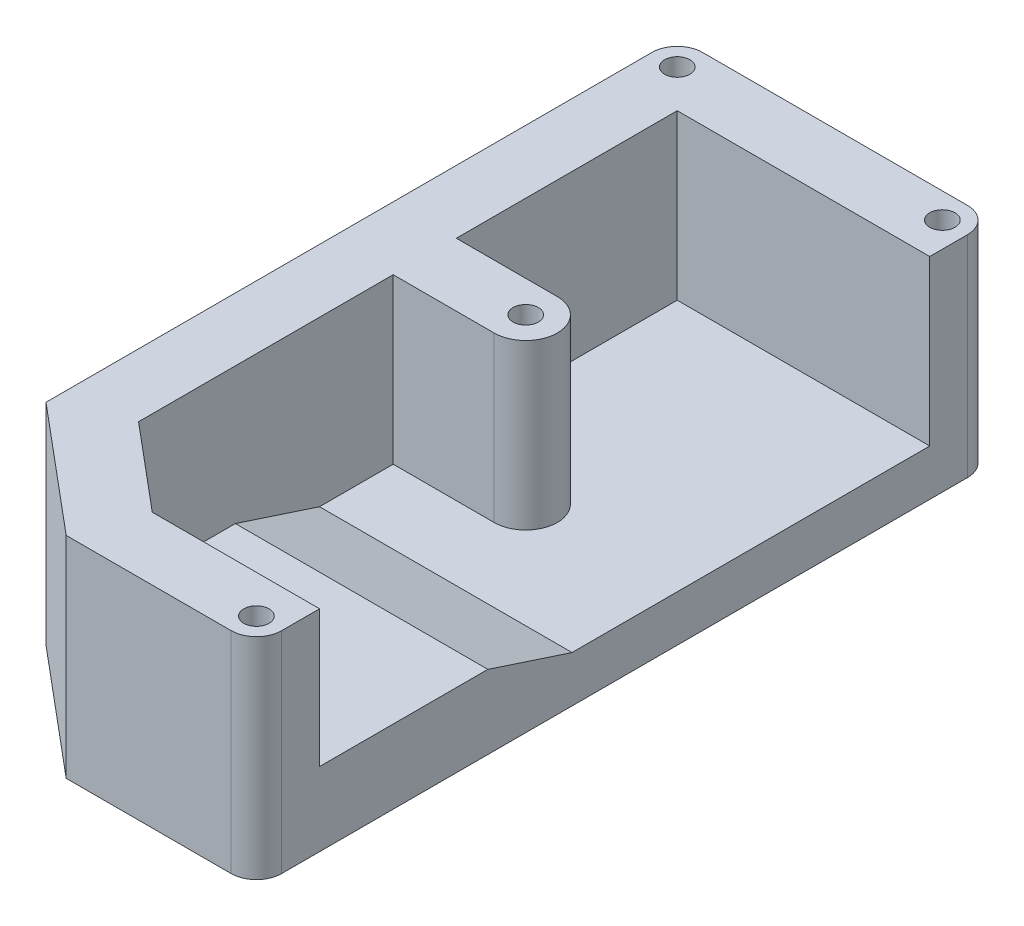
ISO-10303-21;
HEADER;
FILE_DESCRIPTION(('STEP AP214'),'2;1');
FILE_NAME('part.step','',(''),(''),'','','');
FILE_SCHEMA(('AUTOMOTIVE_DESIGN { 1 0 10303 214 1 1 1 1 }'));
ENDSEC;
DATA;
#1=APPLICATION_CONTEXT('core data for automotive mechanical design processes');
#2=APPLICATION_PROTOCOL_DEFINITION('international standard','automotive_design',2000,#1);
#3=PRODUCT_CONTEXT('',#1,'mechanical');
#4=PRODUCT('Part','Part','',(#3));
#5=PRODUCT_RELATED_PRODUCT_CATEGORY('part','',(#4));
#6=PRODUCT_DEFINITION_FORMATION('','',#4);
#7=PRODUCT_DEFINITION_CONTEXT('part definition',#1,'design');
#8=PRODUCT_DEFINITION('design','',#6,#7);
#9=PRODUCT_DEFINITION_SHAPE('','',#8);
#10=(LENGTH_UNIT() NAMED_UNIT(*) SI_UNIT(.MILLI.,.METRE.));
#11=(NAMED_UNIT(*) PLANE_ANGLE_UNIT() SI_UNIT($,.RADIAN.));
#12=(NAMED_UNIT(*) SI_UNIT($,.STERADIAN.) SOLID_ANGLE_UNIT());
#13=UNCERTAINTY_MEASURE_WITH_UNIT(LENGTH_MEASURE(1.E-05),#10,'distance_accuracy_value','');
#14=(GEOMETRIC_REPRESENTATION_CONTEXT(3) GLOBAL_UNCERTAINTY_ASSIGNED_CONTEXT((#13)) GLOBAL_UNIT_ASSIGNED_CONTEXT((#10,
#11,#12)) REPRESENTATION_CONTEXT('',''));
#15=CARTESIAN_POINT('',(0.,0.,0.));
#16=DIRECTION('',(0.,0.,1.));
#17=DIRECTION('',(1.,0.,0.));
#18=AXIS2_PLACEMENT_3D('',#15,#16,#17);
#19=CARTESIAN_POINT('',(69.,11.,6.));
#20=DIRECTION('',(0.,-1.,0.));
#21=DIRECTION('',(0.,0.,-1.));
#22=AXIS2_PLACEMENT_3D('',#19,#20,#21);
#23=CYLINDRICAL_SURFACE('',#22,2.);
#24=CARTESIAN_POINT('',(69.,0.,6.));
#25=DIRECTION('',(0.,1.,0.));
#26=DIRECTION('',(0.,0.,1.));
#27=AXIS2_PLACEMENT_3D('',#24,#25,#26);
#28=CIRCLE('',#27,2.);
#29=CARTESIAN_POINT('',(69.,0.,8.));
#30=VERTEX_POINT('',#29);
#31=EDGE_CURVE('E241',#30,#30,#28,.T.);
#32=ORIENTED_EDGE('',*,*,#31,.F.);
#33=EDGE_LOOP('',(#32));
#34=FACE_BOUND('',#33,.T.);
#35=CARTESIAN_POINT('',(69.,44.,6.));
#36=DIRECTION('',(0.,1.,0.));
#37=DIRECTION('',(0.,0.,1.));
#38=AXIS2_PLACEMENT_3D('',#35,#36,#37);
#39=CIRCLE('',#38,2.);
#40=CARTESIAN_POINT('',(69.,44.,8.));
#41=VERTEX_POINT('',#40);
#42=EDGE_CURVE('E435',#41,#41,#39,.F.);
#43=ORIENTED_EDGE('',*,*,#42,.F.);
#44=EDGE_LOOP('',(#43));
#45=FACE_BOUND('',#44,.T.);
#46=ADVANCED_FACE('F41',(#34,#45),#23,.F.);
#47=CARTESIAN_POINT('',(69.,11.,169.));
#48=DIRECTION('',(0.,-1.,0.));
#49=DIRECTION('',(0.,0.,-1.));
#50=AXIS2_PLACEMENT_3D('',#47,#48,#49);
#51=CYLINDRICAL_SURFACE('',#50,2.);
#52=CARTESIAN_POINT('',(69.,0.,169.));
#53=DIRECTION('',(0.,1.,0.));
#54=DIRECTION('',(0.,0.,1.));
#55=AXIS2_PLACEMENT_3D('',#52,#53,#54);
#56=CIRCLE('',#55,2.);
#57=CARTESIAN_POINT('',(69.,0.,171.));
#58=VERTEX_POINT('',#57);
#59=EDGE_CURVE('E237',#58,#58,#56,.T.);
#60=ORIENTED_EDGE('',*,*,#59,.F.);
#61=EDGE_LOOP('',(#60));
#62=FACE_BOUND('',#61,.T.);
#63=CARTESIAN_POINT('',(69.,44.,169.));
#64=DIRECTION('',(0.,1.,0.));
#65=DIRECTION('',(0.,0.,1.));
#66=AXIS2_PLACEMENT_3D('',#63,#64,#65);
#67=CIRCLE('',#66,2.);
#68=CARTESIAN_POINT('',(69.,44.,171.));
#69=VERTEX_POINT('',#68);
#70=EDGE_CURVE('E447',#69,#69,#67,.F.);
#71=ORIENTED_EDGE('',*,*,#70,.F.);
#72=EDGE_LOOP('',(#71));
#73=FACE_BOUND('',#72,.T.);
#74=ADVANCED_FACE('F485',(#62,#73),#51,.F.);
#75=CARTESIAN_POINT('',(6.,11.,6.));
#76=DIRECTION('',(0.,-1.,0.));
#77=DIRECTION('',(0.,0.,-1.));
#78=AXIS2_PLACEMENT_3D('',#75,#76,#77);
#79=CYLINDRICAL_SURFACE('',#78,2.);
#80=CARTESIAN_POINT('',(6.,0.,6.));
#81=DIRECTION('',(0.,1.,0.));
#82=DIRECTION('',(0.,0.,1.));
#83=AXIS2_PLACEMENT_3D('',#80,#81,#82);
#84=CIRCLE('',#83,2.);
#85=CARTESIAN_POINT('',(6.,0.,8.));
#86=VERTEX_POINT('',#85);
#87=EDGE_CURVE('E233',#86,#86,#84,.T.);
#88=ORIENTED_EDGE('',*,*,#87,.F.);
#89=EDGE_LOOP('',(#88));
#90=FACE_BOUND('',#89,.T.);
#91=CARTESIAN_POINT('',(6.,44.,6.));
#92=DIRECTION('',(0.,1.,0.));
#93=DIRECTION('',(0.,0.,1.));
#94=AXIS2_PLACEMENT_3D('',#91,#92,#93);
#95=CIRCLE('',#94,2.);
#96=CARTESIAN_POINT('',(6.,44.,8.));
#97=VERTEX_POINT('',#96);
#98=EDGE_CURVE('E471',#97,#97,#95,.F.);
#99=ORIENTED_EDGE('',*,*,#98,.F.);
#100=EDGE_LOOP('',(#99));
#101=FACE_BOUND('',#100,.T.);
#102=ADVANCED_FACE('F482',(#90,#101),#79,.F.);
#103=CARTESIAN_POINT('',(39.,11.,75.));
#104=DIRECTION('',(0.,-1.,0.));
#105=DIRECTION('',(0.,0.,-1.));
#106=AXIS2_PLACEMENT_3D('',#103,#104,#105);
#107=CYLINDRICAL_SURFACE('',#106,2.);
#108=CARTESIAN_POINT('',(39.,0.,75.));
#109=DIRECTION('',(0.,1.,0.));
#110=DIRECTION('',(0.,0.,1.));
#111=AXIS2_PLACEMENT_3D('',#108,#109,#110);
#112=CIRCLE('',#111,2.);
#113=CARTESIAN_POINT('',(39.,0.,77.));
#114=VERTEX_POINT('',#113);
#115=EDGE_CURVE('E229',#114,#114,#112,.T.);
#116=ORIENTED_EDGE('',*,*,#115,.F.);
#117=EDGE_LOOP('',(#116));
#118=FACE_BOUND('',#117,.T.);
#119=CARTESIAN_POINT('',(39.,44.,75.));
#120=DIRECTION('',(0.,1.,0.));
#121=DIRECTION('',(0.,0.,1.));
#122=AXIS2_PLACEMENT_3D('',#119,#120,#121);
#123=CIRCLE('',#122,2.);
#124=CARTESIAN_POINT('',(39.,44.,77.));
#125=VERTEX_POINT('',#124);
#126=EDGE_CURVE('E459',#125,#125,#123,.F.);
#127=ORIENTED_EDGE('',*,*,#126,.F.);
#128=EDGE_LOOP('',(#127));
#129=FACE_BOUND('',#128,.T.);
#130=ADVANCED_FACE('F484',(#118,#129),#107,.F.);
#131=CARTESIAN_POINT('',(69.,11.,169.));
#132=DIRECTION('',(0.,1.,0.));
#133=DIRECTION('',(0.,0.,1.));
#134=AXIS2_PLACEMENT_3D('',#131,#132,#133);
#135=PLANE('',#134);
#136=DIRECTION('',(0.,0.,1.));
#137=VECTOR('',#136,1.);
#138=CARTESIAN_POINT('',(15.,11.,0.));
#139=LINE('',#138,#137);
#140=CARTESIAN_POINT('',(15.,11.,82.5));
#141=VERTEX_POINT('',#140);
#142=CARTESIAN_POINT('',(15.,11.,100.));
#143=VERTEX_POINT('',#142);
#144=EDGE_CURVE('E374',#141,#143,#139,.T.);
#145=ORIENTED_EDGE('',*,*,#144,.T.);
#146=DIRECTION('',(1.,0.,0.));
#147=VECTOR('',#146,1.);
#148=CARTESIAN_POINT('',(-0.00200000000002976,11.,100.));
#149=LINE('',#148,#147);
#150=CARTESIAN_POINT('',(75.,11.,100.));
#151=VERTEX_POINT('',#150);
#152=EDGE_CURVE('E57',#143,#151,#149,.T.);
#153=ORIENTED_EDGE('',*,*,#152,.T.);
#154=DIRECTION('',(0.,0.,-1.));
#155=VECTOR('',#154,1.);
#156=CARTESIAN_POINT('',(75.,11.,6.00000000000004));
#157=LINE('',#156,#155);
#158=CARTESIAN_POINT('',(75.,11.,15.));
#159=VERTEX_POINT('',#158);
#160=EDGE_CURVE('E246',#151,#159,#157,.T.);
#161=ORIENTED_EDGE('',*,*,#160,.T.);
#162=DIRECTION('',(-1.,0.,0.));
#163=VECTOR('',#162,1.);
#164=CARTESIAN_POINT('',(0.,11.,15.));
#165=LINE('',#164,#163);
#166=CARTESIAN_POINT('',(15.,11.,15.));
#167=VERTEX_POINT('',#166);
#168=EDGE_CURVE('E371',#159,#167,#165,.T.);
#169=ORIENTED_EDGE('',*,*,#168,.T.);
#170=DIRECTION('',(0.,0.,1.));
#171=VECTOR('',#170,1.);
#172=CARTESIAN_POINT('',(15.,11.,0.));
#173=LINE('',#172,#171);
#174=CARTESIAN_POINT('',(15.,11.,67.5));
#175=VERTEX_POINT('',#174);
#176=EDGE_CURVE('E368',#167,#175,#173,.T.);
#177=ORIENTED_EDGE('',*,*,#176,.T.);
#178=DIRECTION('',(1.,0.,0.));
#179=VECTOR('',#178,1.);
#180=CARTESIAN_POINT('',(0.,11.,67.5));
#181=LINE('',#180,#179);
#182=CARTESIAN_POINT('',(39.,11.,67.5));
#183=VERTEX_POINT('',#182);
#184=EDGE_CURVE('E365',#175,#183,#181,.T.);
#185=ORIENTED_EDGE('',*,*,#184,.T.);
#186=CARTESIAN_POINT('',(39.,11.,75.));
#187=DIRECTION('',(0.,1.,0.));
#188=DIRECTION('',(0.,0.,1.));
#189=AXIS2_PLACEMENT_3D('',#186,#187,#188);
#190=CIRCLE('',#189,7.49999999999999);
#191=CARTESIAN_POINT('',(39.,11.,82.5));
#192=VERTEX_POINT('',#191);
#193=EDGE_CURVE('E361',#192,#183,#190,.T.);
#194=ORIENTED_EDGE('',*,*,#193,.F.);
#195=DIRECTION('',(1.,0.,0.));
#196=VECTOR('',#195,1.);
#197=CARTESIAN_POINT('',(0.,11.,82.5));
#198=LINE('',#197,#196);
#199=EDGE_CURVE('E65',#141,#192,#198,.T.);
#200=ORIENTED_EDGE('',*,*,#199,.F.);
#201=EDGE_LOOP('',(#145,#153,#161,#169,#177,#185,#194,#200));
#202=FACE_BOUND('',#201,.T.);
#203=ADVANCED_FACE('F492',(#202),#135,.T.);
#204=CARTESIAN_POINT('',(0.,50.,160.));
#205=DIRECTION('',(0.,0.,-1.));
#206=DIRECTION('',(-1.,0.,0.));
#207=AXIS2_PLACEMENT_3D('',#204,#205,#206);
#208=PLANE('',#207);
#209=DIRECTION('',(0.,-1.,0.));
#210=VECTOR('',#209,1.);
#211=CARTESIAN_POINT('',(75.,50.,160.));
#212=LINE('',#211,#210);
#213=CARTESIAN_POINT('',(75.,50.,160.));
#214=VERTEX_POINT('',#213);
#215=CARTESIAN_POINT('',(75.,17.535298338577,160.));
#216=VERTEX_POINT('',#215);
#217=EDGE_CURVE('E193',#214,#216,#212,.T.);
#218=ORIENTED_EDGE('',*,*,#217,.T.);
#219=DIRECTION('',(1.,0.,0.));
#220=VECTOR('',#219,1.);
#221=CARTESIAN_POINT('',(-0.00200000000001588,17.535298338577,160.));
#222=LINE('',#221,#220);
#223=CARTESIAN_POINT('',(35.2533933288483,17.535298338577,160.));
#224=VERTEX_POINT('',#223);
#225=EDGE_CURVE('E174',#224,#216,#222,.T.);
#226=ORIENTED_EDGE('',*,*,#225,.F.);
#227=DIRECTION('',(0.,-1.,0.));
#228=VECTOR('',#227,1.);
#229=CARTESIAN_POINT('',(35.2533933288483,50.,160.));
#230=LINE('',#229,#228);
#231=CARTESIAN_POINT('',(35.2533933288483,50.,160.));
#232=VERTEX_POINT('',#231);
#233=EDGE_CURVE('E203',#232,#224,#230,.T.);
#234=ORIENTED_EDGE('',*,*,#233,.F.);
#235=DIRECTION('',(1.,0.,0.));
#236=VECTOR('',#235,1.);
#237=CARTESIAN_POINT('',(0.,50.,160.));
#238=LINE('',#237,#236);
#239=EDGE_CURVE('E200',#232,#214,#238,.T.);
#240=ORIENTED_EDGE('',*,*,#239,.T.);
#241=EDGE_LOOP('',(#218,#226,#234,#240));
#242=FACE_BOUND('',#241,.T.);
#243=ADVANCED_FACE('F198',(#242),#208,.T.);
#244=CARTESIAN_POINT('',(-64.2187673306175,50.,76.5329466782348));
#245=DIRECTION('',(0.642787609686541,0.,-0.766044443118977));
#246=DIRECTION('',(-0.766044443118977,0.,-0.642787609686541));
#247=AXIS2_PLACEMENT_3D('',#244,#245,#246);
#248=PLANE('',#247);
#249=ORIENTED_EDGE('',*,*,#233,.T.);
#250=DIRECTION('',(0.766044443118977,0.,0.642787609686541));
#251=VECTOR('',#250,1.);
#252=CARTESIAN_POINT('',(14.5646792621815,17.535298338577,142.640107657128));
#253=LINE('',#252,#251);
#254=CARTESIAN_POINT('',(15.,17.535298338577,143.005385127675));
#255=VERTEX_POINT('',#254);
#256=EDGE_CURVE('E181',#255,#224,#253,.T.);
#257=ORIENTED_EDGE('',*,*,#256,.F.);
#258=DIRECTION('',(0.,-1.,0.));
#259=VECTOR('',#258,1.);
#260=CARTESIAN_POINT('',(15.,50.,143.005385127675));
#261=LINE('',#260,#259);
#262=CARTESIAN_POINT('',(15.,50.,143.005385127675));
#263=VERTEX_POINT('',#262);
#264=EDGE_CURVE('E210',#263,#255,#261,.T.);
#265=ORIENTED_EDGE('',*,*,#264,.F.);
#266=DIRECTION('',(0.766044443118977,0.,0.642787609686541));
#267=VECTOR('',#266,1.);
#268=CARTESIAN_POINT('',(-64.2187673306175,50.,76.5329466782348));
#269=LINE('',#268,#267);
#270=EDGE_CURVE('E350',#263,#232,#269,.T.);
#271=ORIENTED_EDGE('',*,*,#270,.T.);
#272=EDGE_LOOP('',(#249,#257,#265,#271));
#273=FACE_BOUND('',#272,.T.);
#274=ADVANCED_FACE('F388',(#273),#248,.T.);
#275=CARTESIAN_POINT('',(15.,50.,0.));
#276=DIRECTION('',(1.,0.,0.));
#277=DIRECTION('',(0.,0.,-1.));
#278=AXIS2_PLACEMENT_3D('',#275,#276,#277);
#279=PLANE('',#278);
#280=ORIENTED_EDGE('',*,*,#264,.T.);
#281=DIRECTION('',(0.,0.,1.));
#282=VECTOR('',#281,1.);
#283=CARTESIAN_POINT('',(15.,17.535298338577,160.));
#284=LINE('',#283,#282);
#285=CARTESIAN_POINT('',(15.,17.535298338577,120.));
#286=VERTEX_POINT('',#285);
#287=EDGE_CURVE('E384',#286,#255,#284,.T.);
#288=ORIENTED_EDGE('',*,*,#287,.F.);
#289=DIRECTION('',(0.,0.310603032148749,0.950539718486294));
#290=VECTOR('',#289,1.);
#291=CARTESIAN_POINT('',(15.,17.535298338577,120.));
#292=LINE('',#291,#290);
#293=EDGE_CURVE('E417',#143,#286,#292,.T.);
#294=ORIENTED_EDGE('',*,*,#293,.F.);
#295=ORIENTED_EDGE('',*,*,#144,.F.);
#296=DIRECTION('',(0.,-1.,0.));
#297=VECTOR('',#296,1.);
#298=CARTESIAN_POINT('',(15.,50.,82.5));
#299=LINE('',#298,#297);
#300=CARTESIAN_POINT('',(15.,50.,82.5));
#301=VERTEX_POINT('',#300);
#302=EDGE_CURVE('E358',#301,#141,#299,.T.);
#303=ORIENTED_EDGE('',*,*,#302,.F.);
#304=DIRECTION('',(0.,0.,1.));
#305=VECTOR('',#304,1.);
#306=CARTESIAN_POINT('',(15.,50.,0.));
#307=LINE('',#306,#305);
#308=EDGE_CURVE('E354',#301,#263,#307,.T.);
#309=ORIENTED_EDGE('',*,*,#308,.T.);
#310=EDGE_LOOP('',(#280,#288,#294,#295,#303,#309));
#311=FACE_BOUND('',#310,.T.);
#312=ADVANCED_FACE('F383',(#311),#279,.T.);
#313=CARTESIAN_POINT('',(69.,0.,169.));
#314=DIRECTION('',(0.,1.,0.));
#315=DIRECTION('',(0.,0.,1.));
#316=AXIS2_PLACEMENT_3D('',#313,#314,#315);
#317=PLANE('',#316);
#318=CARTESIAN_POINT('',(69.,0.,169.));
#319=DIRECTION('',(0.,1.,0.));
#320=DIRECTION('',(0.,0.,1.));
#321=AXIS2_PLACEMENT_3D('',#318,#319,#320);
#322=CIRCLE('',#321,6.00000000000001);
#323=CARTESIAN_POINT('',(69.,0.,175.));
#324=VERTEX_POINT('',#323);
#325=CARTESIAN_POINT('',(75.,0.,169.));
#326=VERTEX_POINT('',#325);
#327=EDGE_CURVE('E245',#324,#326,#322,.T.);
#328=ORIENTED_EDGE('',*,*,#327,.F.);
#329=DIRECTION('',(1.,0.,0.));
#330=VECTOR('',#329,1.);
#331=CARTESIAN_POINT('',(29.7938398148552,0.,175.));
#332=LINE('',#331,#330);
#333=CARTESIAN_POINT('',(29.7938398148552,0.,175.));
#334=VERTEX_POINT('',#333);
#335=EDGE_CURVE('E250',#334,#324,#332,.T.);
#336=ORIENTED_EDGE('',*,*,#335,.F.);
#337=DIRECTION('',(0.766044443118977,0.,0.642787609686541));
#338=VECTOR('',#337,1.);
#339=CARTESIAN_POINT('',(0.,0.,150.));
#340=LINE('',#339,#338);
#341=CARTESIAN_POINT('',(0.,0.,150.));
#342=VERTEX_POINT('',#341);
#343=EDGE_CURVE('E269',#342,#334,#340,.T.);
#344=ORIENTED_EDGE('',*,*,#343,.F.);
#345=DIRECTION('',(0.,0.,1.));
#346=VECTOR('',#345,1.);
#347=CARTESIAN_POINT('',(0.,0.,6.00000000000004));
#348=LINE('',#347,#346);
#349=CARTESIAN_POINT('',(0.,0.,6.00000000000004));
#350=VERTEX_POINT('',#349);
#351=EDGE_CURVE('E266',#350,#342,#348,.T.);
#352=ORIENTED_EDGE('',*,*,#351,.F.);
#353=CARTESIAN_POINT('',(6.,0.,6.));
#354=DIRECTION('',(0.,1.,0.));
#355=DIRECTION('',(0.,0.,1.));
#356=AXIS2_PLACEMENT_3D('',#353,#354,#355);
#357=CIRCLE('',#356,6.);
#358=CARTESIAN_POINT('',(6.00000000000004,0.,0.));
#359=VERTEX_POINT('',#358);
#360=EDGE_CURVE('E263',#359,#350,#357,.T.);
#361=ORIENTED_EDGE('',*,*,#360,.F.);
#362=DIRECTION('',(-1.,0.,0.));
#363=VECTOR('',#362,1.);
#364=CARTESIAN_POINT('',(6.00000000000004,0.,0.));
#365=LINE('',#364,#363);
#366=CARTESIAN_POINT('',(68.9999999999999,0.,0.));
#367=VERTEX_POINT('',#366);
#368=EDGE_CURVE('E260',#367,#359,#365,.T.);
#369=ORIENTED_EDGE('',*,*,#368,.F.);
#370=CARTESIAN_POINT('',(69.,0.,6.));
#371=DIRECTION('',(0.,1.,0.));
#372=DIRECTION('',(0.,0.,-1.));
#373=AXIS2_PLACEMENT_3D('',#370,#371,#372);
#374=CIRCLE('',#373,6.);
#375=CARTESIAN_POINT('',(75.,0.,6.00000000000004));
#376=VERTEX_POINT('',#375);
#377=EDGE_CURVE('E257',#376,#367,#374,.T.);
#378=ORIENTED_EDGE('',*,*,#377,.F.);
#379=DIRECTION('',(0.,0.,-1.));
#380=VECTOR('',#379,1.);
#381=CARTESIAN_POINT('',(75.,0.,6.00000000000004));
#382=LINE('',#381,#380);
#383=EDGE_CURVE('E254',#326,#376,#382,.T.);
#384=ORIENTED_EDGE('',*,*,#383,.F.);
#385=EDGE_LOOP('',(#328,#336,#344,#352,#361,#369,#378,#384));
#386=FACE_BOUND('',#385,.T.);
#387=ORIENTED_EDGE('',*,*,#31,.T.);
#388=EDGE_LOOP('',(#387));
#389=FACE_BOUND('',#388,.T.);
#390=ORIENTED_EDGE('',*,*,#59,.T.);
#391=EDGE_LOOP('',(#390));
#392=FACE_BOUND('',#391,.T.);
#393=ORIENTED_EDGE('',*,*,#87,.T.);
#394=EDGE_LOOP('',(#393));
#395=FACE_BOUND('',#394,.T.);
#396=ORIENTED_EDGE('',*,*,#115,.T.);
#397=EDGE_LOOP('',(#396));
#398=FACE_BOUND('',#397,.T.);
#399=ADVANCED_FACE('F309',(#386,#389,#392,#395,#398),#317,.F.);
#400=CARTESIAN_POINT('',(69.,11.,169.));
#401=DIRECTION('',(0.,-1.,0.));
#402=DIRECTION('',(0.,0.,-1.));
#403=AXIS2_PLACEMENT_3D('',#400,#401,#402);
#404=CYLINDRICAL_SURFACE('',#403,6.00000000000001);
#405=ORIENTED_EDGE('',*,*,#327,.T.);
#406=DIRECTION('',(0.,-1.,0.));
#407=VECTOR('',#406,1.);
#408=CARTESIAN_POINT('',(75.,11.,169.));
#409=LINE('',#408,#407);
#410=CARTESIAN_POINT('',(75.,50.,169.));
#411=VERTEX_POINT('',#410);
#412=EDGE_CURVE('E11',#411,#326,#409,.T.);
#413=ORIENTED_EDGE('',*,*,#412,.F.);
#414=CARTESIAN_POINT('',(69.,50.,169.));
#415=DIRECTION('',(0.,1.,0.));
#416=DIRECTION('',(0.,0.,1.));
#417=AXIS2_PLACEMENT_3D('',#414,#415,#416);
#418=CIRCLE('',#417,6.00000000000001);
#419=CARTESIAN_POINT('',(69.,50.,175.));
#420=VERTEX_POINT('',#419);
#421=EDGE_CURVE('E343',#420,#411,#418,.T.);
#422=ORIENTED_EDGE('',*,*,#421,.F.);
#423=DIRECTION('',(0.,-1.,0.));
#424=VECTOR('',#423,1.);
#425=CARTESIAN_POINT('',(69.,11.,175.));
#426=LINE('',#425,#424);
#427=EDGE_CURVE('E249',#420,#324,#426,.T.);
#428=ORIENTED_EDGE('',*,*,#427,.T.);
#429=EDGE_LOOP('',(#405,#413,#422,#428));
#430=FACE_BOUND('',#429,.T.);
#431=ADVANCED_FACE('F43',(#430),#404,.T.);
#432=CARTESIAN_POINT('',(75.,11.,6.00000000000004));
#433=DIRECTION('',(-1.,0.,0.));
#434=DIRECTION('',(0.,0.,1.));
#435=AXIS2_PLACEMENT_3D('',#432,#433,#434);
#436=PLANE('',#435);
#437=ORIENTED_EDGE('',*,*,#160,.F.);
#438=DIRECTION('',(0.,-0.310603032148749,-0.950539718486294));
#439=VECTOR('',#438,1.);
#440=CARTESIAN_POINT('',(75.,17.535298338577,120.));
#441=LINE('',#440,#439);
#442=CARTESIAN_POINT('',(75.,17.535298338577,120.));
#443=VERTEX_POINT('',#442);
#444=EDGE_CURVE('E195',#443,#151,#441,.T.);
#445=ORIENTED_EDGE('',*,*,#444,.F.);
#446=DIRECTION('',(0.,0.,-1.));
#447=VECTOR('',#446,1.);
#448=CARTESIAN_POINT('',(75.,17.535298338577,160.));
#449=LINE('',#448,#447);
#450=EDGE_CURVE('E178',#216,#443,#449,.T.);
#451=ORIENTED_EDGE('',*,*,#450,.F.);
#452=ORIENTED_EDGE('',*,*,#217,.F.);
#453=DIRECTION('',(0.,0.,-1.));
#454=VECTOR('',#453,1.);
#455=CARTESIAN_POINT('',(75.,50.,0.));
#456=LINE('',#455,#454);
#457=EDGE_CURVE('E347',#411,#214,#456,.T.);
#458=ORIENTED_EDGE('',*,*,#457,.F.);
#459=ORIENTED_EDGE('',*,*,#412,.T.);
#460=ORIENTED_EDGE('',*,*,#383,.T.);
#461=DIRECTION('',(0.,-1.,0.));
#462=VECTOR('',#461,1.);
#463=CARTESIAN_POINT('',(75.,11.,6.00000000000004));
#464=LINE('',#463,#462);
#465=CARTESIAN_POINT('',(75.,50.,6.00000000000004));
#466=VERTEX_POINT('',#465);
#467=EDGE_CURVE('E50',#466,#376,#464,.T.);
#468=ORIENTED_EDGE('',*,*,#467,.F.);
#469=CARTESIAN_POINT('',(75.,50.,15.));
#470=VERTEX_POINT('',#469);
#471=EDGE_CURVE('E394',#470,#466,#456,.T.);
#472=ORIENTED_EDGE('',*,*,#471,.F.);
#473=DIRECTION('',(0.,-1.,0.));
#474=VECTOR('',#473,1.);
#475=CARTESIAN_POINT('',(75.,50.,15.));
#476=LINE('',#475,#474);
#477=EDGE_CURVE('E202',#470,#159,#476,.T.);
#478=ORIENTED_EDGE('',*,*,#477,.T.);
#479=EDGE_LOOP('',(#437,#445,#451,#452,#458,#459,#460,#468,#472,#478));
#480=FACE_BOUND('',#479,.T.);
#481=ADVANCED_FACE('F191',(#480),#436,.F.);
#482=CARTESIAN_POINT('',(69.,11.,6.));
#483=DIRECTION('',(0.,-1.,0.));
#484=DIRECTION('',(0.,0.,-1.));
#485=AXIS2_PLACEMENT_3D('',#482,#483,#484);
#486=CYLINDRICAL_SURFACE('',#485,6.);
#487=ORIENTED_EDGE('',*,*,#377,.T.);
#488=DIRECTION('',(0.,-1.,0.));
#489=VECTOR('',#488,1.);
#490=CARTESIAN_POINT('',(68.9999999999999,11.,0.));
#491=LINE('',#490,#489);
#492=CARTESIAN_POINT('',(68.9999999999999,50.,0.));
#493=VERTEX_POINT('',#492);
#494=EDGE_CURVE('E293',#493,#367,#491,.T.);
#495=ORIENTED_EDGE('',*,*,#494,.F.);
#496=CARTESIAN_POINT('',(69.,50.,6.));
#497=DIRECTION('',(0.,1.,0.));
#498=DIRECTION('',(0.,0.,1.));
#499=AXIS2_PLACEMENT_3D('',#496,#497,#498);
#500=CIRCLE('',#499,6.);
#501=EDGE_CURVE('E303',#466,#493,#500,.T.);
#502=ORIENTED_EDGE('',*,*,#501,.F.);
#503=ORIENTED_EDGE('',*,*,#467,.T.);
#504=EDGE_LOOP('',(#487,#495,#502,#503));
#505=FACE_BOUND('',#504,.T.);
#506=ADVANCED_FACE('F301',(#505),#486,.T.);
#507=CARTESIAN_POINT('',(6.00000000000004,11.,0.));
#508=DIRECTION('',(0.,0.,1.));
#509=DIRECTION('',(1.,0.,0.));
#510=AXIS2_PLACEMENT_3D('',#507,#508,#509);
#511=PLANE('',#510);
#512=ORIENTED_EDGE('',*,*,#368,.T.);
#513=DIRECTION('',(0.,-1.,0.));
#514=VECTOR('',#513,1.);
#515=CARTESIAN_POINT('',(6.00000000000004,11.,0.));
#516=LINE('',#515,#514);
#517=CARTESIAN_POINT('',(6.00000000000004,50.,0.));
#518=VERTEX_POINT('',#517);
#519=EDGE_CURVE('E289',#518,#359,#516,.T.);
#520=ORIENTED_EDGE('',*,*,#519,.F.);
#521=DIRECTION('',(-1.,0.,0.));
#522=VECTOR('',#521,1.);
#523=CARTESIAN_POINT('',(0.,50.,0.));
#524=LINE('',#523,#522);
#525=EDGE_CURVE('E327',#493,#518,#524,.T.);
#526=ORIENTED_EDGE('',*,*,#525,.F.);
#527=ORIENTED_EDGE('',*,*,#494,.T.);
#528=EDGE_LOOP('',(#512,#520,#526,#527));
#529=FACE_BOUND('',#528,.T.);
#530=ADVANCED_FACE('F314',(#529),#511,.F.);
#531=CARTESIAN_POINT('',(6.,11.,6.));
#532=DIRECTION('',(0.,-1.,0.));
#533=DIRECTION('',(0.,0.,-1.));
#534=AXIS2_PLACEMENT_3D('',#531,#532,#533);
#535=CYLINDRICAL_SURFACE('',#534,6.);
#536=ORIENTED_EDGE('',*,*,#360,.T.);
#537=DIRECTION('',(0.,-1.,0.));
#538=VECTOR('',#537,1.);
#539=CARTESIAN_POINT('',(0.,11.,6.00000000000004));
#540=LINE('',#539,#538);
#541=CARTESIAN_POINT('',(0.,50.,6.00000000000004));
#542=VERTEX_POINT('',#541);
#543=EDGE_CURVE('E285',#542,#350,#540,.T.);
#544=ORIENTED_EDGE('',*,*,#543,.F.);
#545=CARTESIAN_POINT('',(6.,50.,6.));
#546=DIRECTION('',(0.,1.,0.));
#547=DIRECTION('',(0.,0.,1.));
#548=AXIS2_PLACEMENT_3D('',#545,#546,#547);
#549=CIRCLE('',#548,6.);
#550=EDGE_CURVE('E321',#518,#542,#549,.T.);
#551=ORIENTED_EDGE('',*,*,#550,.F.);
#552=ORIENTED_EDGE('',*,*,#519,.T.);
#553=EDGE_LOOP('',(#536,#544,#551,#552));
#554=FACE_BOUND('',#553,.T.);
#555=ADVANCED_FACE('F319',(#554),#535,.T.);
#556=CARTESIAN_POINT('',(0.,11.,6.00000000000004));
#557=DIRECTION('',(1.,0.,0.));
#558=DIRECTION('',(0.,0.,-1.));
#559=AXIS2_PLACEMENT_3D('',#556,#557,#558);
#560=PLANE('',#559);
#561=ORIENTED_EDGE('',*,*,#351,.T.);
#562=DIRECTION('',(0.,-1.,0.));
#563=VECTOR('',#562,1.);
#564=CARTESIAN_POINT('',(0.,11.,150.));
#565=LINE('',#564,#563);
#566=CARTESIAN_POINT('',(0.,50.,150.));
#567=VERTEX_POINT('',#566);
#568=EDGE_CURVE('E281',#567,#342,#565,.T.);
#569=ORIENTED_EDGE('',*,*,#568,.F.);
#570=DIRECTION('',(0.,0.,1.));
#571=VECTOR('',#570,1.);
#572=CARTESIAN_POINT('',(0.,50.,0.));
#573=LINE('',#572,#571);
#574=EDGE_CURVE('E326',#542,#567,#573,.T.);
#575=ORIENTED_EDGE('',*,*,#574,.F.);
#576=ORIENTED_EDGE('',*,*,#543,.T.);
#577=EDGE_LOOP('',(#561,#569,#575,#576));
#578=FACE_BOUND('',#577,.T.);
#579=ADVANCED_FACE('F518',(#578),#560,.F.);
#580=CARTESIAN_POINT('',(0.,11.,150.));
#581=DIRECTION('',(0.642787609686541,0.,-0.766044443118977));
#582=DIRECTION('',(-0.766044443118977,0.,-0.642787609686541));
#583=AXIS2_PLACEMENT_3D('',#580,#581,#582);
#584=PLANE('',#583);
#585=ORIENTED_EDGE('',*,*,#343,.T.);
#586=DIRECTION('',(0.,-1.,0.));
#587=VECTOR('',#586,1.);
#588=CARTESIAN_POINT('',(29.7938398148552,11.,175.));
#589=LINE('',#588,#587);
#590=CARTESIAN_POINT('',(29.7938398148552,50.,175.));
#591=VERTEX_POINT('',#590);
#592=EDGE_CURVE('E277',#591,#334,#589,.T.);
#593=ORIENTED_EDGE('',*,*,#592,.F.);
#594=DIRECTION('',(0.766044443118977,0.,0.642787609686541));
#595=VECTOR('',#594,1.);
#596=CARTESIAN_POINT('',(-73.8605814759156,50.,88.0236133250195));
#597=LINE('',#596,#595);
#598=EDGE_CURVE('E331',#567,#591,#597,.T.);
#599=ORIENTED_EDGE('',*,*,#598,.F.);
#600=ORIENTED_EDGE('',*,*,#568,.T.);
#601=EDGE_LOOP('',(#585,#593,#599,#600));
#602=FACE_BOUND('',#601,.T.);
#603=ADVANCED_FACE('F514',(#602),#584,.F.);
#604=CARTESIAN_POINT('',(29.7938398148552,11.,175.));
#605=DIRECTION('',(0.,0.,-1.));
#606=DIRECTION('',(-1.,0.,0.));
#607=AXIS2_PLACEMENT_3D('',#604,#605,#606);
#608=PLANE('',#607);
#609=ORIENTED_EDGE('',*,*,#335,.T.);
#610=ORIENTED_EDGE('',*,*,#427,.F.);
#611=DIRECTION('',(1.,0.,0.));
#612=VECTOR('',#611,1.);
#613=CARTESIAN_POINT('',(0.,50.,175.));
#614=LINE('',#613,#612);
#615=EDGE_CURVE('E339',#591,#420,#614,.T.);
#616=ORIENTED_EDGE('',*,*,#615,.F.);
#617=ORIENTED_EDGE('',*,*,#592,.T.);
#618=EDGE_LOOP('',(#609,#610,#616,#617));
#619=FACE_BOUND('',#618,.T.);
#620=ADVANCED_FACE('F510',(#619),#608,.F.);
#621=CARTESIAN_POINT('',(0.,50.,82.5));
#622=DIRECTION('',(0.,0.,-1.));
#623=DIRECTION('',(-1.,0.,0.));
#624=AXIS2_PLACEMENT_3D('',#621,#622,#623);
#625=PLANE('',#624);
#626=ORIENTED_EDGE('',*,*,#199,.T.);
#627=DIRECTION('',(0.,-1.,0.));
#628=VECTOR('',#627,1.);
#629=CARTESIAN_POINT('',(39.,50.,82.5));
#630=LINE('',#629,#628);
#631=CARTESIAN_POINT('',(39.,50.,82.5));
#632=VERTEX_POINT('',#631);
#633=EDGE_CURVE('E225',#632,#192,#630,.T.);
#634=ORIENTED_EDGE('',*,*,#633,.F.);
#635=DIRECTION('',(1.,0.,0.));
#636=VECTOR('',#635,1.);
#637=CARTESIAN_POINT('',(0.,50.,82.5));
#638=LINE('',#637,#636);
#639=EDGE_CURVE('E377',#301,#632,#638,.T.);
#640=ORIENTED_EDGE('',*,*,#639,.F.);
#641=ORIENTED_EDGE('',*,*,#302,.T.);
#642=EDGE_LOOP('',(#626,#634,#640,#641));
#643=FACE_BOUND('',#642,.T.);
#644=ADVANCED_FACE('F513',(#643),#625,.F.);
#645=CARTESIAN_POINT('',(39.,50.,75.));
#646=DIRECTION('',(0.,-1.,0.));
#647=DIRECTION('',(0.,0.,-1.));
#648=AXIS2_PLACEMENT_3D('',#645,#646,#647);
#649=CYLINDRICAL_SURFACE('',#648,7.49999999999999);
#650=ORIENTED_EDGE('',*,*,#193,.T.);
#651=DIRECTION('',(0.,-1.,0.));
#652=VECTOR('',#651,1.);
#653=CARTESIAN_POINT('',(39.,50.,67.5));
#654=LINE('',#653,#652);
#655=CARTESIAN_POINT('',(39.,50.,67.5));
#656=VERTEX_POINT('',#655);
#657=EDGE_CURVE('E221',#656,#183,#654,.T.);
#658=ORIENTED_EDGE('',*,*,#657,.F.);
#659=CARTESIAN_POINT('',(39.,50.,75.));
#660=DIRECTION('',(0.,1.,0.));
#661=DIRECTION('',(0.,0.,1.));
#662=AXIS2_PLACEMENT_3D('',#659,#660,#661);
#663=CIRCLE('',#662,7.49999999999999);
#664=EDGE_CURVE('E412',#632,#656,#663,.T.);
#665=ORIENTED_EDGE('',*,*,#664,.F.);
#666=ORIENTED_EDGE('',*,*,#633,.T.);
#667=EDGE_LOOP('',(#650,#658,#665,#666));
#668=FACE_BOUND('',#667,.T.);
#669=ADVANCED_FACE('F687',(#668),#649,.T.);
#670=CARTESIAN_POINT('',(0.,50.,67.5));
#671=DIRECTION('',(0.,0.,-1.));
#672=DIRECTION('',(-1.,0.,0.));
#673=AXIS2_PLACEMENT_3D('',#670,#671,#672);
#674=PLANE('',#673);
#675=ORIENTED_EDGE('',*,*,#184,.F.);
#676=DIRECTION('',(0.,-1.,0.));
#677=VECTOR('',#676,1.);
#678=CARTESIAN_POINT('',(15.,50.,67.5));
#679=LINE('',#678,#677);
#680=CARTESIAN_POINT('',(15.,50.,67.5));
#681=VERTEX_POINT('',#680);
#682=EDGE_CURVE('E217',#681,#175,#679,.T.);
#683=ORIENTED_EDGE('',*,*,#682,.F.);
#684=DIRECTION('',(1.,0.,0.));
#685=VECTOR('',#684,1.);
#686=CARTESIAN_POINT('',(0.,50.,67.5));
#687=LINE('',#686,#685);
#688=EDGE_CURVE('E406',#681,#656,#687,.T.);
#689=ORIENTED_EDGE('',*,*,#688,.T.);
#690=ORIENTED_EDGE('',*,*,#657,.T.);
#691=EDGE_LOOP('',(#675,#683,#689,#690));
#692=FACE_BOUND('',#691,.T.);
#693=ADVANCED_FACE('F683',(#692),#674,.T.);
#694=CARTESIAN_POINT('',(15.,50.,0.));
#695=DIRECTION('',(1.,0.,0.));
#696=DIRECTION('',(0.,0.,-1.));
#697=AXIS2_PLACEMENT_3D('',#694,#695,#696);
#698=PLANE('',#697);
#699=ORIENTED_EDGE('',*,*,#176,.F.);
#700=DIRECTION('',(0.,-1.,0.));
#701=VECTOR('',#700,1.);
#702=CARTESIAN_POINT('',(15.,50.,15.));
#703=LINE('',#702,#701);
#704=CARTESIAN_POINT('',(15.,50.,15.));
#705=VERTEX_POINT('',#704);
#706=EDGE_CURVE('E208',#705,#167,#703,.T.);
#707=ORIENTED_EDGE('',*,*,#706,.F.);
#708=DIRECTION('',(0.,0.,1.));
#709=VECTOR('',#708,1.);
#710=CARTESIAN_POINT('',(15.,50.,0.));
#711=LINE('',#710,#709);
#712=EDGE_CURVE('E402',#705,#681,#711,.T.);
#713=ORIENTED_EDGE('',*,*,#712,.T.);
#714=ORIENTED_EDGE('',*,*,#682,.T.);
#715=EDGE_LOOP('',(#699,#707,#713,#714));
#716=FACE_BOUND('',#715,.T.);
#717=ADVANCED_FACE('F680',(#716),#698,.T.);
#718=CARTESIAN_POINT('',(0.,50.,15.));
#719=DIRECTION('',(0.,0.,1.));
#720=DIRECTION('',(1.,0.,0.));
#721=AXIS2_PLACEMENT_3D('',#718,#719,#720);
#722=PLANE('',#721);
#723=ORIENTED_EDGE('',*,*,#168,.F.);
#724=ORIENTED_EDGE('',*,*,#477,.F.);
#725=DIRECTION('',(-1.,0.,0.));
#726=VECTOR('',#725,1.);
#727=CARTESIAN_POINT('',(0.,50.,15.));
#728=LINE('',#727,#726);
#729=EDGE_CURVE('E397',#470,#705,#728,.T.);
#730=ORIENTED_EDGE('',*,*,#729,.T.);
#731=ORIENTED_EDGE('',*,*,#706,.T.);
#732=EDGE_LOOP('',(#723,#724,#730,#731));
#733=FACE_BOUND('',#732,.T.);
#734=ADVANCED_FACE('F585',(#733),#722,.T.);
#735=CARTESIAN_POINT('',(0.,50.,0.));
#736=DIRECTION('',(0.,1.,0.));
#737=DIRECTION('',(0.,0.,1.));
#738=AXIS2_PLACEMENT_3D('',#735,#736,#737);
#739=PLANE('',#738);
#740=CARTESIAN_POINT('',(69.,50.,169.));
#741=DIRECTION('',(0.,1.,0.));
#742=DIRECTION('',(0.,0.,1.));
#743=AXIS2_PLACEMENT_3D('',#740,#741,#742);
#744=CIRCLE('',#743,3.00000000000001);
#745=CARTESIAN_POINT('',(69.,50.,172.));
#746=VERTEX_POINT('',#745);
#747=EDGE_CURVE('E443',#746,#746,#744,.T.);
#748=ORIENTED_EDGE('',*,*,#747,.F.);
#749=EDGE_LOOP('',(#748));
#750=FACE_BOUND('',#749,.T.);
#751=CARTESIAN_POINT('',(39.,50.,75.));
#752=DIRECTION('',(0.,1.,0.));
#753=DIRECTION('',(0.,0.,1.));
#754=AXIS2_PLACEMENT_3D('',#751,#752,#753);
#755=CIRCLE('',#754,3.);
#756=CARTESIAN_POINT('',(39.,50.,78.));
#757=VERTEX_POINT('',#756);
#758=EDGE_CURVE('E452',#757,#757,#755,.T.);
#759=ORIENTED_EDGE('',*,*,#758,.F.);
#760=EDGE_LOOP('',(#759));
#761=FACE_BOUND('',#760,.T.);
#762=CARTESIAN_POINT('',(6.,50.,6.));
#763=DIRECTION('',(0.,1.,0.));
#764=DIRECTION('',(0.,0.,1.));
#765=AXIS2_PLACEMENT_3D('',#762,#763,#764);
#766=CIRCLE('',#765,3.);
#767=CARTESIAN_POINT('',(6.,50.,9.));
#768=VERTEX_POINT('',#767);
#769=EDGE_CURVE('E464',#768,#768,#766,.T.);
#770=ORIENTED_EDGE('',*,*,#769,.F.);
#771=EDGE_LOOP('',(#770));
#772=FACE_BOUND('',#771,.T.);
#773=CARTESIAN_POINT('',(69.,50.,6.));
#774=DIRECTION('',(0.,1.,0.));
#775=DIRECTION('',(0.,0.,1.));
#776=AXIS2_PLACEMENT_3D('',#773,#774,#775);
#777=CIRCLE('',#776,3.00000000000001);
#778=CARTESIAN_POINT('',(69.,50.,9.00000000000001));
#779=VERTEX_POINT('',#778);
#780=EDGE_CURVE('E431',#779,#779,#777,.T.);
#781=ORIENTED_EDGE('',*,*,#780,.F.);
#782=EDGE_LOOP('',(#781));
#783=FACE_BOUND('',#782,.T.);
#784=ORIENTED_EDGE('',*,*,#639,.T.);
#785=ORIENTED_EDGE('',*,*,#664,.T.);
#786=ORIENTED_EDGE('',*,*,#688,.F.);
#787=ORIENTED_EDGE('',*,*,#712,.F.);
#788=ORIENTED_EDGE('',*,*,#729,.F.);
#789=ORIENTED_EDGE('',*,*,#471,.T.);
#790=ORIENTED_EDGE('',*,*,#501,.T.);
#791=ORIENTED_EDGE('',*,*,#525,.T.);
#792=ORIENTED_EDGE('',*,*,#550,.T.);
#793=ORIENTED_EDGE('',*,*,#574,.T.);
#794=ORIENTED_EDGE('',*,*,#598,.T.);
#795=ORIENTED_EDGE('',*,*,#615,.T.);
#796=ORIENTED_EDGE('',*,*,#421,.T.);
#797=ORIENTED_EDGE('',*,*,#457,.T.);
#798=ORIENTED_EDGE('',*,*,#239,.F.);
#799=ORIENTED_EDGE('',*,*,#270,.F.);
#800=ORIENTED_EDGE('',*,*,#308,.F.);
#801=EDGE_LOOP('',(#784,#785,#786,#787,#788,#789,#790,#791,#792,#793,#794,#795,#796,#797,#798,
#799,#800));
#802=FACE_BOUND('',#801,.T.);
#803=ADVANCED_FACE('F390',(#750,#761,#772,#783,#802),#739,.T.);
#804=CARTESIAN_POINT('',(-0.00200000000001588,17.535298338577,160.));
#805=DIRECTION('',(0.,-1.,0.));
#806=DIRECTION('',(0.,0.,-1.));
#807=AXIS2_PLACEMENT_3D('',#804,#805,#806);
#808=PLANE('',#807);
#809=DIRECTION('',(1.,0.,0.));
#810=VECTOR('',#809,1.);
#811=CARTESIAN_POINT('',(-0.00200000000002976,17.535298338577,120.));
#812=LINE('',#811,#810);
#813=EDGE_CURVE('E186',#286,#443,#812,.T.);
#814=ORIENTED_EDGE('',*,*,#813,.F.);
#815=ORIENTED_EDGE('',*,*,#287,.T.);
#816=ORIENTED_EDGE('',*,*,#256,.T.);
#817=ORIENTED_EDGE('',*,*,#225,.T.);
#818=ORIENTED_EDGE('',*,*,#450,.T.);
#819=EDGE_LOOP('',(#814,#815,#816,#817,#818));
#820=FACE_BOUND('',#819,.T.);
#821=ADVANCED_FACE('F177',(#820),#808,.F.);
#822=CARTESIAN_POINT('',(-0.00200000000002976,17.535298338577,120.));
#823=DIRECTION('',(0.,-0.950539718486294,0.310603032148749));
#824=DIRECTION('',(0.,-0.310603032148749,-0.950539718486294));
#825=AXIS2_PLACEMENT_3D('',#822,#823,#824);
#826=PLANE('',#825);
#827=ORIENTED_EDGE('',*,*,#152,.F.);
#828=ORIENTED_EDGE('',*,*,#293,.T.);
#829=ORIENTED_EDGE('',*,*,#813,.T.);
#830=ORIENTED_EDGE('',*,*,#444,.T.);
#831=EDGE_LOOP('',(#827,#828,#829,#830));
#832=FACE_BOUND('',#831,.T.);
#833=ADVANCED_FACE('F588',(#832),#826,.F.);
#834=CARTESIAN_POINT('',(69.,44.,6.));
#835=DIRECTION('',(0.,1.,0.));
#836=DIRECTION('',(0.,0.,1.));
#837=AXIS2_PLACEMENT_3D('',#834,#835,#836);
#838=CYLINDRICAL_SURFACE('',#837,3.00000000000001);
#839=CARTESIAN_POINT('',(69.,44.,6.));
#840=DIRECTION('',(0.,1.,0.));
#841=DIRECTION('',(0.,0.,1.));
#842=AXIS2_PLACEMENT_3D('',#839,#840,#841);
#843=CIRCLE('',#842,3.00000000000001);
#844=CARTESIAN_POINT('',(69.,44.,9.00000000000001));
#845=VERTEX_POINT('',#844);
#846=EDGE_CURVE('E429',#845,#845,#843,.T.);
#847=ORIENTED_EDGE('',*,*,#846,.F.);
#848=EDGE_LOOP('',(#847));
#849=FACE_BOUND('',#848,.T.);
#850=ORIENTED_EDGE('',*,*,#780,.T.);
#851=EDGE_LOOP('',(#850));
#852=FACE_BOUND('',#851,.T.);
#853=ADVANCED_FACE('F596',(#849,#852),#838,.F.);
#854=CARTESIAN_POINT('',(0.,44.,0.));
#855=DIRECTION('',(0.,1.,0.));
#856=DIRECTION('',(0.,0.,1.));
#857=AXIS2_PLACEMENT_3D('',#854,#855,#856);
#858=PLANE('',#857);
#859=ORIENTED_EDGE('',*,*,#42,.T.);
#860=EDGE_LOOP('',(#859));
#861=FACE_BOUND('',#860,.T.);
#862=ORIENTED_EDGE('',*,*,#846,.T.);
#863=EDGE_LOOP('',(#862));
#864=FACE_BOUND('',#863,.T.);
#865=ADVANCED_FACE('F601',(#861,#864),#858,.T.);
#866=CARTESIAN_POINT('',(6.,44.,6.));
#867=DIRECTION('',(0.,1.,0.));
#868=DIRECTION('',(0.,0.,1.));
#869=AXIS2_PLACEMENT_3D('',#866,#867,#868);
#870=CYLINDRICAL_SURFACE('',#869,3.);
#871=CARTESIAN_POINT('',(6.,44.,6.));
#872=DIRECTION('',(0.,1.,0.));
#873=DIRECTION('',(0.,0.,1.));
#874=AXIS2_PLACEMENT_3D('',#871,#872,#873);
#875=CIRCLE('',#874,3.);
#876=CARTESIAN_POINT('',(6.,44.,9.));
#877=VERTEX_POINT('',#876);
#878=EDGE_CURVE('E436',#877,#877,#875,.T.);
#879=ORIENTED_EDGE('',*,*,#878,.F.);
#880=EDGE_LOOP('',(#879));
#881=FACE_BOUND('',#880,.T.);
#882=ORIENTED_EDGE('',*,*,#769,.T.);
#883=EDGE_LOOP('',(#882));
#884=FACE_BOUND('',#883,.T.);
#885=ADVANCED_FACE('F613',(#881,#884),#870,.F.);
#886=CARTESIAN_POINT('',(0.,44.,0.));
#887=DIRECTION('',(0.,1.,0.));
#888=DIRECTION('',(0.,0.,1.));
#889=AXIS2_PLACEMENT_3D('',#886,#887,#888);
#890=PLANE('',#889);
#891=ORIENTED_EDGE('',*,*,#98,.T.);
#892=EDGE_LOOP('',(#891));
#893=FACE_BOUND('',#892,.T.);
#894=ORIENTED_EDGE('',*,*,#878,.T.);
#895=EDGE_LOOP('',(#894));
#896=FACE_BOUND('',#895,.T.);
#897=ADVANCED_FACE('F479',(#893,#896),#890,.T.);
#898=CARTESIAN_POINT('',(39.,44.,75.));
#899=DIRECTION('',(0.,1.,0.));
#900=DIRECTION('',(0.,0.,1.));
#901=AXIS2_PLACEMENT_3D('',#898,#899,#900);
#902=CYLINDRICAL_SURFACE('',#901,3.);
#903=CARTESIAN_POINT('',(39.,44.,75.));
#904=DIRECTION('',(0.,1.,0.));
#905=DIRECTION('',(0.,0.,1.));
#906=AXIS2_PLACEMENT_3D('',#903,#904,#905);
#907=CIRCLE('',#906,3.);
#908=CARTESIAN_POINT('',(39.,44.,78.));
#909=VERTEX_POINT('',#908);
#910=EDGE_CURVE('E460',#909,#909,#907,.T.);
#911=ORIENTED_EDGE('',*,*,#910,.F.);
#912=EDGE_LOOP('',(#911));
#913=FACE_BOUND('',#912,.T.);
#914=ORIENTED_EDGE('',*,*,#758,.T.);
#915=EDGE_LOOP('',(#914));
#916=FACE_BOUND('',#915,.T.);
#917=ADVANCED_FACE('F632',(#913,#916),#902,.F.);
#918=CARTESIAN_POINT('',(0.,44.,0.));
#919=DIRECTION('',(0.,1.,0.));
#920=DIRECTION('',(0.,0.,1.));
#921=AXIS2_PLACEMENT_3D('',#918,#919,#920);
#922=PLANE('',#921);
#923=ORIENTED_EDGE('',*,*,#126,.T.);
#924=EDGE_LOOP('',(#923));
#925=FACE_BOUND('',#924,.T.);
#926=ORIENTED_EDGE('',*,*,#910,.T.);
#927=EDGE_LOOP('',(#926));
#928=FACE_BOUND('',#927,.T.);
#929=ADVANCED_FACE('F641',(#925,#928),#922,.T.);
#930=CARTESIAN_POINT('',(69.,44.,169.));
#931=DIRECTION('',(0.,1.,0.));
#932=DIRECTION('',(0.,0.,1.));
#933=AXIS2_PLACEMENT_3D('',#930,#931,#932);
#934=CYLINDRICAL_SURFACE('',#933,3.00000000000001);
#935=CARTESIAN_POINT('',(69.,44.,169.));
#936=DIRECTION('',(0.,1.,0.));
#937=DIRECTION('',(0.,0.,1.));
#938=AXIS2_PLACEMENT_3D('',#935,#936,#937);
#939=CIRCLE('',#938,3.00000000000001);
#940=CARTESIAN_POINT('',(69.,44.,172.));
#941=VERTEX_POINT('',#940);
#942=EDGE_CURVE('E448',#941,#941,#939,.T.);
#943=ORIENTED_EDGE('',*,*,#942,.F.);
#944=EDGE_LOOP('',(#943));
#945=FACE_BOUND('',#944,.T.);
#946=ORIENTED_EDGE('',*,*,#747,.T.);
#947=EDGE_LOOP('',(#946));
#948=FACE_BOUND('',#947,.T.);
#949=ADVANCED_FACE('F651',(#945,#948),#934,.F.);
#950=CARTESIAN_POINT('',(0.,44.,0.));
#951=DIRECTION('',(0.,1.,0.));
#952=DIRECTION('',(0.,0.,1.));
#953=AXIS2_PLACEMENT_3D('',#950,#951,#952);
#954=PLANE('',#953);
#955=ORIENTED_EDGE('',*,*,#70,.T.);
#956=EDGE_LOOP('',(#955));
#957=FACE_BOUND('',#956,.T.);
#958=ORIENTED_EDGE('',*,*,#942,.T.);
#959=EDGE_LOOP('',(#958));
#960=FACE_BOUND('',#959,.T.);
#961=ADVANCED_FACE('F661',(#957,#960),#954,.T.);
#962=CLOSED_SHELL('',(#46,#74,#102,#130,#203,#243,#274,#312,#399,#431,#481,#506,#530,#555,#579,
#603,#620,#644,#669,#693,#717,#734,#803,#821,#833,#853,#865,#885,#897,#917,#929,#949,#961));
#963=MANIFOLD_SOLID_BREP('B2',#962);
#964=ADVANCED_BREP_SHAPE_REPRESENTATION('',(#18,#963),#14);
#965=SHAPE_DEFINITION_REPRESENTATION(#9,#964);
ENDSEC;
END-ISO-10303-21;
